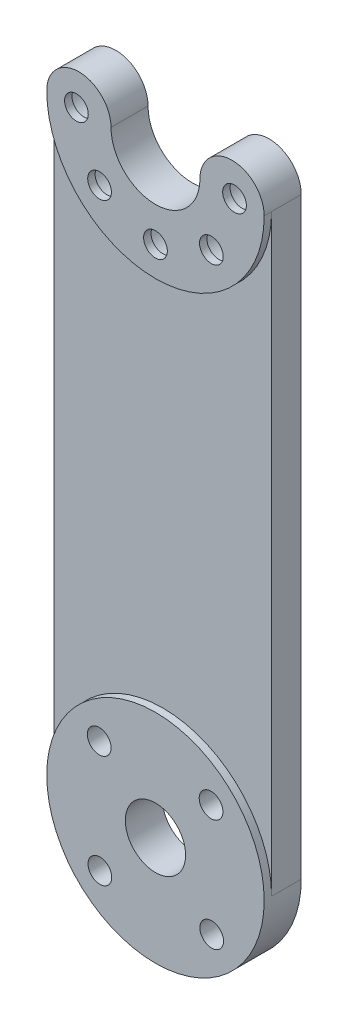
ISO-10303-21;
HEADER;
FILE_DESCRIPTION(('STEP AP214'),'2;1');
FILE_NAME('part.step','',(''),(''),'','','');
FILE_SCHEMA(('AUTOMOTIVE_DESIGN { 1 0 10303 214 1 1 1 1 }'));
ENDSEC;
DATA;
#1=APPLICATION_CONTEXT('core data for automotive mechanical design processes');
#2=APPLICATION_PROTOCOL_DEFINITION('international standard','automotive_design',2000,#1);
#3=PRODUCT_CONTEXT('',#1,'mechanical');
#4=PRODUCT('Part','Part','',(#3));
#5=PRODUCT_RELATED_PRODUCT_CATEGORY('part','',(#4));
#6=PRODUCT_DEFINITION_FORMATION('','',#4);
#7=PRODUCT_DEFINITION_CONTEXT('part definition',#1,'design');
#8=PRODUCT_DEFINITION('design','',#6,#7);
#9=PRODUCT_DEFINITION_SHAPE('','',#8);
#10=(LENGTH_UNIT() NAMED_UNIT(*) SI_UNIT(.MILLI.,.METRE.));
#11=(NAMED_UNIT(*) PLANE_ANGLE_UNIT() SI_UNIT($,.RADIAN.));
#12=(NAMED_UNIT(*) SI_UNIT($,.STERADIAN.) SOLID_ANGLE_UNIT());
#13=UNCERTAINTY_MEASURE_WITH_UNIT(LENGTH_MEASURE(1.E-05),#10,'distance_accuracy_value','');
#14=(GEOMETRIC_REPRESENTATION_CONTEXT(3) GLOBAL_UNCERTAINTY_ASSIGNED_CONTEXT((#13)) GLOBAL_UNIT_ASSIGNED_CONTEXT((#10,
#11,#12)) REPRESENTATION_CONTEXT('',''));
#15=CARTESIAN_POINT('',(0.,0.,0.));
#16=DIRECTION('',(0.,0.,1.));
#17=DIRECTION('',(1.,0.,0.));
#18=AXIS2_PLACEMENT_3D('',#15,#16,#17);
#19=CARTESIAN_POINT('',(-3.87500000000011,0.,0.));
#20=DIRECTION('',(0.,0.,1.));
#21=DIRECTION('',(1.,0.,0.));
#22=AXIS2_PLACEMENT_3D('',#19,#20,#21);
#23=PLANE('',#22);
#24=CARTESIAN_POINT('',(7.99999999999991,0.,0.));
#25=DIRECTION('',(0.,0.,1.));
#26=DIRECTION('',(1.,0.,0.));
#27=AXIS2_PLACEMENT_3D('',#24,#25,#26);
#28=CIRCLE('',#27,1.2);
#29=CARTESIAN_POINT('',(9.19999999999991,0.,0.));
#30=VERTEX_POINT('',#29);
#31=EDGE_CURVE('E383',#30,#30,#28,.T.);
#32=ORIENTED_EDGE('',*,*,#31,.F.);
#33=EDGE_LOOP('',(#32));
#34=FACE_BOUND('',#33,.T.);
#35=CARTESIAN_POINT('',(5.65685424949229,-5.65685424949237,0.));
#36=DIRECTION('',(0.,0.,1.));
#37=DIRECTION('',(1.,0.,0.));
#38=AXIS2_PLACEMENT_3D('',#35,#36,#37);
#39=CIRCLE('',#38,1.2);
#40=CARTESIAN_POINT('',(6.85685424949229,-5.65685424949237,0.));
#41=VERTEX_POINT('',#40);
#42=EDGE_CURVE('E395',#41,#41,#39,.T.);
#43=ORIENTED_EDGE('',*,*,#42,.F.);
#44=EDGE_LOOP('',(#43));
#45=FACE_BOUND('',#44,.T.);
#46=CARTESIAN_POINT('',(0.,-7.99999999999999,0.));
#47=DIRECTION('',(0.,0.,1.));
#48=DIRECTION('',(1.,0.,0.));
#49=AXIS2_PLACEMENT_3D('',#46,#47,#48);
#50=CIRCLE('',#49,1.2);
#51=CARTESIAN_POINT('',(1.19999999999991,-7.99999999999999,0.));
#52=VERTEX_POINT('',#51);
#53=EDGE_CURVE('E407',#52,#52,#50,.T.);
#54=ORIENTED_EDGE('',*,*,#53,.F.);
#55=EDGE_LOOP('',(#54));
#56=FACE_BOUND('',#55,.T.);
#57=CARTESIAN_POINT('',(-5.65685424949247,-5.65685424949237,0.));
#58=DIRECTION('',(0.,0.,1.));
#59=DIRECTION('',(1.,0.,0.));
#60=AXIS2_PLACEMENT_3D('',#57,#58,#59);
#61=CIRCLE('',#60,1.2);
#62=CARTESIAN_POINT('',(-4.45685424949247,-5.65685424949237,0.));
#63=VERTEX_POINT('',#62);
#64=EDGE_CURVE('E419',#63,#63,#61,.T.);
#65=ORIENTED_EDGE('',*,*,#64,.F.);
#66=EDGE_LOOP('',(#65));
#67=FACE_BOUND('',#66,.T.);
#68=CARTESIAN_POINT('',(-8.00000000000009,0.,0.));
#69=DIRECTION('',(0.,0.,1.));
#70=DIRECTION('',(1.,0.,0.));
#71=AXIS2_PLACEMENT_3D('',#68,#69,#70);
#72=CIRCLE('',#71,1.2);
#73=CARTESIAN_POINT('',(-6.80000000000009,0.,0.));
#74=VERTEX_POINT('',#73);
#75=EDGE_CURVE('E138',#74,#74,#72,.T.);
#76=ORIENTED_EDGE('',*,*,#75,.F.);
#77=EDGE_LOOP('',(#76));
#78=FACE_BOUND('',#77,.T.);
#79=CARTESIAN_POINT('',(-7.75000000000013,0.,0.));
#80=DIRECTION('',(0.,0.,1.));
#81=DIRECTION('',(1.,0.,0.));
#82=AXIS2_PLACEMENT_3D('',#79,#80,#81);
#83=CIRCLE('',#82,3.24999999999996);
#84=CARTESIAN_POINT('',(-4.50000000000017,0.,0.));
#85=VERTEX_POINT('',#84);
#86=CARTESIAN_POINT('',(-11.0000000000002,0.,0.));
#87=VERTEX_POINT('',#86);
#88=EDGE_CURVE('E144',#85,#87,#83,.T.);
#89=ORIENTED_EDGE('',*,*,#88,.T.);
#90=CARTESIAN_POINT('',(0.,0.,0.));
#91=DIRECTION('',(0.,0.,1.));
#92=DIRECTION('',(-1.,0.,0.));
#93=AXIS2_PLACEMENT_3D('',#90,#91,#92);
#94=CIRCLE('',#93,11.0000000000001);
#95=CARTESIAN_POINT('',(11.0000000000002,0.,0.));
#96=VERTEX_POINT('',#95);
#97=EDGE_CURVE('E151',#87,#96,#94,.T.);
#98=ORIENTED_EDGE('',*,*,#97,.T.);
#99=CARTESIAN_POINT('',(7.75000000000013,0.,0.));
#100=DIRECTION('',(0.,0.,1.));
#101=DIRECTION('',(1.,0.,0.));
#102=AXIS2_PLACEMENT_3D('',#99,#100,#101);
#103=CIRCLE('',#102,3.25000000000004);
#104=CARTESIAN_POINT('',(4.5,0.,0.));
#105=VERTEX_POINT('',#104);
#106=EDGE_CURVE('E148',#96,#105,#103,.T.);
#107=ORIENTED_EDGE('',*,*,#106,.T.);
#108=CARTESIAN_POINT('',(0.,0.,0.));
#109=DIRECTION('',(0.,0.,-1.));
#110=DIRECTION('',(1.,0.,0.));
#111=AXIS2_PLACEMENT_3D('',#108,#109,#110);
#112=CIRCLE('',#111,4.50000000000009);
#113=EDGE_CURVE('E145',#105,#85,#112,.T.);
#114=ORIENTED_EDGE('',*,*,#113,.T.);
#115=EDGE_LOOP('',(#89,#98,#107,#114));
#116=FACE_BOUND('',#115,.T.);
#117=ADVANCED_FACE('F35',(#34,#45,#56,#67,#78,#116),#23,.T.);
#118=CARTESIAN_POINT('',(0.,0.,-28.9618770789125));
#119=DIRECTION('',(0.,0.,1.));
#120=DIRECTION('',(1.,0.,0.));
#121=AXIS2_PLACEMENT_3D('',#118,#119,#120);
#122=CYLINDRICAL_SURFACE('',#121,11.0000000000001);
#123=DIRECTION('',(0.,0.,1.));
#124=VECTOR('',#123,1.);
#125=CARTESIAN_POINT('',(-11.0000000000002,0.,-28.9618770789125));
#126=LINE('',#125,#124);
#127=CARTESIAN_POINT('',(-11.0000000000002,0.,-0.749999999999987));
#128=VERTEX_POINT('',#127);
#129=EDGE_CURVE('E11',#128,#87,#126,.T.);
#130=ORIENTED_EDGE('',*,*,#129,.F.);
#131=CARTESIAN_POINT('',(0.,0.,-0.749999999999987));
#132=DIRECTION('',(0.,0.,-1.));
#133=DIRECTION('',(-1.,0.,0.));
#134=AXIS2_PLACEMENT_3D('',#131,#132,#133);
#135=CIRCLE('',#134,11.0000000000001);
#136=CARTESIAN_POINT('',(11.0000000000002,0.,-0.749999999999983));
#137=VERTEX_POINT('',#136);
#138=EDGE_CURVE('E95',#128,#137,#135,.F.);
#139=ORIENTED_EDGE('',*,*,#138,.T.);
#140=DIRECTION('',(0.,0.,1.));
#141=VECTOR('',#140,1.);
#142=CARTESIAN_POINT('',(11.0000000000002,0.,-28.9618770789125));
#143=LINE('',#142,#141);
#144=EDGE_CURVE('E67',#137,#96,#143,.T.);
#145=ORIENTED_EDGE('',*,*,#144,.T.);
#146=ORIENTED_EDGE('',*,*,#97,.F.);
#147=EDGE_LOOP('',(#130,#139,#145,#146));
#148=FACE_BOUND('',#147,.T.);
#149=ADVANCED_FACE('F37',(#148),#122,.T.);
#150=CARTESIAN_POINT('',(7.75000000000013,0.,-28.9618770789125));
#151=DIRECTION('',(0.,0.,1.));
#152=DIRECTION('',(1.,0.,0.));
#153=AXIS2_PLACEMENT_3D('',#150,#151,#152);
#154=CYLINDRICAL_SURFACE('',#153,3.25000000000004);
#155=ORIENTED_EDGE('',*,*,#144,.F.);
#156=DIRECTION('',(0.,0.,1.));
#157=VECTOR('',#156,1.);
#158=CARTESIAN_POINT('',(11.0000000000002,0.,-3.74999999999999));
#159=LINE('',#158,#157);
#160=CARTESIAN_POINT('',(11.0000000000002,0.,-3.74999999999999));
#161=VERTEX_POINT('',#160);
#162=EDGE_CURVE('E125',#161,#137,#159,.T.);
#163=ORIENTED_EDGE('',*,*,#162,.F.);
#164=CARTESIAN_POINT('',(7.75000000000013,0.,-3.74999999999999));
#165=DIRECTION('',(0.,0.,-1.));
#166=DIRECTION('',(-1.,0.,0.));
#167=AXIS2_PLACEMENT_3D('',#164,#165,#166);
#168=CIRCLE('',#167,3.25000000000004);
#169=CARTESIAN_POINT('',(4.50000000000009,0.,-3.74999999999999));
#170=VERTEX_POINT('',#169);
#171=EDGE_CURVE('E116',#170,#161,#168,.T.);
#172=ORIENTED_EDGE('',*,*,#171,.F.);
#173=DIRECTION('',(0.,0.,1.));
#174=VECTOR('',#173,1.);
#175=CARTESIAN_POINT('',(4.5,0.,-28.9618770789125));
#176=LINE('',#175,#174);
#177=EDGE_CURVE('E158',#170,#105,#176,.T.);
#178=ORIENTED_EDGE('',*,*,#177,.T.);
#179=ORIENTED_EDGE('',*,*,#106,.F.);
#180=EDGE_LOOP('',(#155,#163,#172,#178,#179));
#181=FACE_BOUND('',#180,.T.);
#182=ADVANCED_FACE('F160',(#181),#154,.T.);
#183=CARTESIAN_POINT('',(0.,0.,-28.9618770789125));
#184=DIRECTION('',(0.,0.,1.));
#185=DIRECTION('',(1.,0.,0.));
#186=AXIS2_PLACEMENT_3D('',#183,#184,#185);
#187=CYLINDRICAL_SURFACE('',#186,4.50000000000009);
#188=ORIENTED_EDGE('',*,*,#177,.F.);
#189=CARTESIAN_POINT('',(0.,0.,-3.74999999999999));
#190=DIRECTION('',(0.,0.,1.));
#191=DIRECTION('',(-1.,0.,0.));
#192=AXIS2_PLACEMENT_3D('',#189,#190,#191);
#193=CIRCLE('',#192,4.50000000000013);
#194=CARTESIAN_POINT('',(-4.50000000000022,0.,-3.74999999999999));
#195=VERTEX_POINT('',#194);
#196=EDGE_CURVE('E434',#195,#170,#193,.T.);
#197=ORIENTED_EDGE('',*,*,#196,.F.);
#198=DIRECTION('',(0.,0.,1.));
#199=VECTOR('',#198,1.);
#200=CARTESIAN_POINT('',(-4.50000000000017,0.,-28.9618770789125));
#201=LINE('',#200,#199);
#202=EDGE_CURVE('E43',#195,#85,#201,.T.);
#203=ORIENTED_EDGE('',*,*,#202,.T.);
#204=ORIENTED_EDGE('',*,*,#113,.F.);
#205=EDGE_LOOP('',(#188,#197,#203,#204));
#206=FACE_BOUND('',#205,.T.);
#207=ADVANCED_FACE('F162',(#206),#187,.F.);
#208=CARTESIAN_POINT('',(-7.75000000000013,0.,-28.9618770789125));
#209=DIRECTION('',(0.,0.,1.));
#210=DIRECTION('',(1.,0.,0.));
#211=AXIS2_PLACEMENT_3D('',#208,#209,#210);
#212=CYLINDRICAL_SURFACE('',#211,3.24999999999996);
#213=ORIENTED_EDGE('',*,*,#202,.F.);
#214=CARTESIAN_POINT('',(-7.75000000000013,0.,-3.74999999999999));
#215=DIRECTION('',(0.,0.,-1.));
#216=DIRECTION('',(-1.,0.,0.));
#217=AXIS2_PLACEMENT_3D('',#214,#215,#216);
#218=CIRCLE('',#217,3.25);
#219=CARTESIAN_POINT('',(-11.0000000000002,0.,-3.74999999999999));
#220=VERTEX_POINT('',#219);
#221=EDGE_CURVE('E140',#220,#195,#218,.T.);
#222=ORIENTED_EDGE('',*,*,#221,.F.);
#223=DIRECTION('',(0.,0.,1.));
#224=VECTOR('',#223,1.);
#225=CARTESIAN_POINT('',(-11.0000000000002,0.,-3.74999999999999));
#226=LINE('',#225,#224);
#227=EDGE_CURVE('E132',#220,#128,#226,.T.);
#228=ORIENTED_EDGE('',*,*,#227,.T.);
#229=ORIENTED_EDGE('',*,*,#129,.T.);
#230=ORIENTED_EDGE('',*,*,#88,.F.);
#231=EDGE_LOOP('',(#213,#222,#228,#229,#230));
#232=FACE_BOUND('',#231,.T.);
#233=ADVANCED_FACE('F164',(#232),#212,.T.);
#234=CARTESIAN_POINT('',(11.0000000000002,0.,-3.74999999999999));
#235=DIRECTION('',(-1.,0.,0.));
#236=DIRECTION('',(0.,0.,1.));
#237=AXIS2_PLACEMENT_3D('',#234,#235,#236);
#238=PLANE('',#237);
#239=DIRECTION('',(0.,-1.,0.));
#240=VECTOR('',#239,1.);
#241=CARTESIAN_POINT('',(11.0000000000002,0.,-0.749999999999987));
#242=LINE('',#241,#240);
#243=CARTESIAN_POINT('',(11.0000000000002,-60.,-0.749999999999987));
#244=VERTEX_POINT('',#243);
#245=EDGE_CURVE('E75',#137,#244,#242,.T.);
#246=ORIENTED_EDGE('',*,*,#245,.T.);
#247=DIRECTION('',(0.,0.,1.));
#248=VECTOR('',#247,1.);
#249=CARTESIAN_POINT('',(11.0000000000002,-60.,-3.74999999999999));
#250=LINE('',#249,#248);
#251=CARTESIAN_POINT('',(11.0000000000002,-60.,-3.74999999999999));
#252=VERTEX_POINT('',#251);
#253=EDGE_CURVE('E121',#252,#244,#250,.T.);
#254=ORIENTED_EDGE('',*,*,#253,.F.);
#255=DIRECTION('',(0.,-1.,0.));
#256=VECTOR('',#255,1.);
#257=CARTESIAN_POINT('',(11.0000000000002,0.,-3.74999999999999));
#258=LINE('',#257,#256);
#259=EDGE_CURVE('E108',#161,#252,#258,.T.);
#260=ORIENTED_EDGE('',*,*,#259,.F.);
#261=ORIENTED_EDGE('',*,*,#162,.T.);
#262=EDGE_LOOP('',(#246,#254,#260,#261));
#263=FACE_BOUND('',#262,.T.);
#264=ADVANCED_FACE('F122',(#263),#238,.F.);
#265=CARTESIAN_POINT('',(0.,-59.9999999999999,-3.74999999999999));
#266=DIRECTION('',(0.,0.,1.));
#267=DIRECTION('',(1.,0.,0.));
#268=AXIS2_PLACEMENT_3D('',#265,#266,#267);
#269=CYLINDRICAL_SURFACE('',#268,11.0000000000002);
#270=ORIENTED_EDGE('',*,*,#253,.T.);
#271=CARTESIAN_POINT('',(0.,-59.9999999999999,-0.749999999999987));
#272=DIRECTION('',(0.,0.,1.));
#273=DIRECTION('',(1.,0.,0.));
#274=AXIS2_PLACEMENT_3D('',#271,#272,#273);
#275=CIRCLE('',#274,11.0000000000002);
#276=CARTESIAN_POINT('',(-11.0000000000002,-59.9999999999999,-0.749999999999987));
#277=VERTEX_POINT('',#276);
#278=EDGE_CURVE('E367',#244,#277,#275,.T.);
#279=ORIENTED_EDGE('',*,*,#278,.T.);
#280=DIRECTION('',(0.,0.,1.));
#281=VECTOR('',#280,1.);
#282=CARTESIAN_POINT('',(-11.0000000000002,-60.,-3.74999999999999));
#283=LINE('',#282,#281);
#284=CARTESIAN_POINT('',(-11.0000000000002,-60.,-3.74999999999999));
#285=VERTEX_POINT('',#284);
#286=EDGE_CURVE('E126',#285,#277,#283,.T.);
#287=ORIENTED_EDGE('',*,*,#286,.F.);
#288=CARTESIAN_POINT('',(0.,-59.9999999999999,-3.74999999999999));
#289=DIRECTION('',(0.,0.,-1.));
#290=DIRECTION('',(-1.,0.,0.));
#291=AXIS2_PLACEMENT_3D('',#288,#289,#290);
#292=CIRCLE('',#291,11.0000000000002);
#293=EDGE_CURVE('E112',#252,#285,#292,.T.);
#294=ORIENTED_EDGE('',*,*,#293,.F.);
#295=EDGE_LOOP('',(#270,#279,#287,#294));
#296=FACE_BOUND('',#295,.T.);
#297=CARTESIAN_POINT('',(0.,-59.9999999999999,0.));
#298=DIRECTION('',(0.,0.,-1.));
#299=DIRECTION('',(0.,1.,0.));
#300=AXIS2_PLACEMENT_3D('',#297,#298,#299);
#301=CIRCLE('',#300,11.0000000000002);
#302=CARTESIAN_POINT('',(0.,-48.9999999999997,0.));
#303=VERTEX_POINT('',#302);
#304=EDGE_CURVE('E371',#303,#303,#301,.T.);
#305=ORIENTED_EDGE('',*,*,#304,.T.);
#306=EDGE_LOOP('',(#305));
#307=FACE_BOUND('',#306,.T.);
#308=ADVANCED_FACE('F128',(#296,#307),#269,.T.);
#309=CARTESIAN_POINT('',(-11.0000000000002,-60.,-3.74999999999999));
#310=DIRECTION('',(1.,0.,0.));
#311=DIRECTION('',(0.,0.,-1.));
#312=AXIS2_PLACEMENT_3D('',#309,#310,#311);
#313=PLANE('',#312);
#314=DIRECTION('',(0.,1.,0.));
#315=VECTOR('',#314,1.);
#316=CARTESIAN_POINT('',(-11.0000000000002,-60.,-0.749999999999987));
#317=LINE('',#316,#315);
#318=EDGE_CURVE('E137',#277,#128,#317,.T.);
#319=ORIENTED_EDGE('',*,*,#318,.T.);
#320=ORIENTED_EDGE('',*,*,#227,.F.);
#321=DIRECTION('',(0.,1.,0.));
#322=VECTOR('',#321,1.);
#323=CARTESIAN_POINT('',(-11.0000000000002,-60.,-3.74999999999999));
#324=LINE('',#323,#322);
#325=EDGE_CURVE('E84',#285,#220,#324,.T.);
#326=ORIENTED_EDGE('',*,*,#325,.F.);
#327=ORIENTED_EDGE('',*,*,#286,.T.);
#328=EDGE_LOOP('',(#319,#320,#326,#327));
#329=FACE_BOUND('',#328,.T.);
#330=ADVANCED_FACE('F184',(#329),#313,.F.);
#331=CARTESIAN_POINT('',(-7.75000000000013,0.,-3.74999999999999));
#332=DIRECTION('',(0.,0.,-1.));
#333=DIRECTION('',(-1.,0.,0.));
#334=AXIS2_PLACEMENT_3D('',#331,#332,#333);
#335=PLANE('',#334);
#336=CARTESIAN_POINT('',(5.6887856422345,-65.6247415866602,-3.74999999999999));
#337=DIRECTION('',(0.,0.,-1.));
#338=DIRECTION('',(-1.,0.,0.));
#339=AXIS2_PLACEMENT_3D('',#336,#337,#338);
#340=CIRCLE('',#339,2.19999999999999);
#341=CARTESIAN_POINT('',(3.4887856422345,-65.6247415866602,-3.74999999999999));
#342=VERTEX_POINT('',#341);
#343=EDGE_CURVE('E317',#342,#342,#340,.T.);
#344=ORIENTED_EDGE('',*,*,#343,.F.);
#345=EDGE_LOOP('',(#344));
#346=FACE_BOUND('',#345,.T.);
#347=CARTESIAN_POINT('',(5.62474158666032,-54.3112143577653,-3.74999999999999));
#348=DIRECTION('',(0.,0.,-1.));
#349=DIRECTION('',(-1.,0.,0.));
#350=AXIS2_PLACEMENT_3D('',#347,#348,#349);
#351=CIRCLE('',#350,2.19999999999999);
#352=CARTESIAN_POINT('',(3.42474158666033,-54.3112143577653,-3.74999999999999));
#353=VERTEX_POINT('',#352);
#354=EDGE_CURVE('E327',#353,#353,#351,.T.);
#355=ORIENTED_EDGE('',*,*,#354,.F.);
#356=EDGE_LOOP('',(#355));
#357=FACE_BOUND('',#356,.T.);
#358=CARTESIAN_POINT('',(-5.68878564223454,-54.3752584133395,-3.74999999999999));
#359=DIRECTION('',(0.,0.,-1.));
#360=DIRECTION('',(-1.,0.,0.));
#361=AXIS2_PLACEMENT_3D('',#358,#359,#360);
#362=CIRCLE('',#361,2.19999999999999);
#363=CARTESIAN_POINT('',(-7.88878564223453,-54.3752584133395,-3.74999999999999));
#364=VERTEX_POINT('',#363);
#365=EDGE_CURVE('E339',#364,#364,#362,.T.);
#366=ORIENTED_EDGE('',*,*,#365,.F.);
#367=EDGE_LOOP('',(#366));
#368=FACE_BOUND('',#367,.T.);
#369=CARTESIAN_POINT('',(-5.62474158666032,-65.6887856422344,-3.74999999999999));
#370=DIRECTION('',(0.,0.,-1.));
#371=DIRECTION('',(-1.,0.,0.));
#372=AXIS2_PLACEMENT_3D('',#369,#370,#371);
#373=CIRCLE('',#372,2.19999999999999);
#374=CARTESIAN_POINT('',(-7.82474158666031,-65.6887856422344,-3.74999999999999));
#375=VERTEX_POINT('',#374);
#376=EDGE_CURVE('E351',#375,#375,#373,.T.);
#377=ORIENTED_EDGE('',*,*,#376,.F.);
#378=EDGE_LOOP('',(#377));
#379=FACE_BOUND('',#378,.T.);
#380=CARTESIAN_POINT('',(0.,-59.9999999999999,-3.74999999999999));
#381=DIRECTION('',(0.,0.,-1.));
#382=DIRECTION('',(-1.,0.,0.));
#383=AXIS2_PLACEMENT_3D('',#380,#381,#382);
#384=CIRCLE('',#383,3.05000000000001);
#385=CARTESIAN_POINT('',(-3.05000000000001,-59.9999999999999,-3.74999999999999));
#386=VERTEX_POINT('',#385);
#387=EDGE_CURVE('E363',#386,#386,#384,.T.);
#388=ORIENTED_EDGE('',*,*,#387,.F.);
#389=EDGE_LOOP('',(#388));
#390=FACE_BOUND('',#389,.T.);
#391=CARTESIAN_POINT('',(7.99999999999991,0.,-3.74999999999999));
#392=DIRECTION('',(0.,0.,-1.));
#393=DIRECTION('',(-1.,0.,0.));
#394=AXIS2_PLACEMENT_3D('',#391,#392,#393);
#395=CIRCLE('',#394,2.2);
#396=CARTESIAN_POINT('',(5.79999999999991,0.,-3.74999999999999));
#397=VERTEX_POINT('',#396);
#398=EDGE_CURVE('E374',#397,#397,#395,.T.);
#399=ORIENTED_EDGE('',*,*,#398,.F.);
#400=EDGE_LOOP('',(#399));
#401=FACE_BOUND('',#400,.T.);
#402=CARTESIAN_POINT('',(5.65685424949229,-5.65685424949237,-3.74999999999999));
#403=DIRECTION('',(0.,0.,-1.));
#404=DIRECTION('',(-1.,0.,0.));
#405=AXIS2_PLACEMENT_3D('',#402,#403,#404);
#406=CIRCLE('',#405,2.2);
#407=CARTESIAN_POINT('',(3.45685424949229,-5.65685424949237,-3.74999999999999));
#408=VERTEX_POINT('',#407);
#409=EDGE_CURVE('E386',#408,#408,#406,.T.);
#410=ORIENTED_EDGE('',*,*,#409,.F.);
#411=EDGE_LOOP('',(#410));
#412=FACE_BOUND('',#411,.T.);
#413=CARTESIAN_POINT('',(0.,-7.99999999999999,-3.74999999999999));
#414=DIRECTION('',(0.,0.,-1.));
#415=DIRECTION('',(-1.,0.,0.));
#416=AXIS2_PLACEMENT_3D('',#413,#414,#415);
#417=CIRCLE('',#416,2.2);
#418=CARTESIAN_POINT('',(-2.20000000000009,-7.99999999999999,-3.74999999999999));
#419=VERTEX_POINT('',#418);
#420=EDGE_CURVE('E398',#419,#419,#417,.T.);
#421=ORIENTED_EDGE('',*,*,#420,.F.);
#422=EDGE_LOOP('',(#421));
#423=FACE_BOUND('',#422,.T.);
#424=CARTESIAN_POINT('',(-5.65685424949247,-5.65685424949237,-3.74999999999999));
#425=DIRECTION('',(0.,0.,-1.));
#426=DIRECTION('',(-1.,0.,0.));
#427=AXIS2_PLACEMENT_3D('',#424,#425,#426);
#428=CIRCLE('',#427,2.2);
#429=CARTESIAN_POINT('',(-7.85685424949247,-5.65685424949237,-3.74999999999999));
#430=VERTEX_POINT('',#429);
#431=EDGE_CURVE('E410',#430,#430,#428,.T.);
#432=ORIENTED_EDGE('',*,*,#431,.F.);
#433=EDGE_LOOP('',(#432));
#434=FACE_BOUND('',#433,.T.);
#435=CARTESIAN_POINT('',(-8.00000000000009,0.,-3.74999999999999));
#436=DIRECTION('',(0.,0.,-1.));
#437=DIRECTION('',(-1.,0.,0.));
#438=AXIS2_PLACEMENT_3D('',#435,#436,#437);
#439=CIRCLE('',#438,2.2);
#440=CARTESIAN_POINT('',(-10.2000000000001,0.,-3.74999999999999));
#441=VERTEX_POINT('',#440);
#442=EDGE_CURVE('E422',#441,#441,#439,.T.);
#443=ORIENTED_EDGE('',*,*,#442,.F.);
#444=EDGE_LOOP('',(#443));
#445=FACE_BOUND('',#444,.T.);
#446=ORIENTED_EDGE('',*,*,#221,.T.);
#447=ORIENTED_EDGE('',*,*,#196,.T.);
#448=ORIENTED_EDGE('',*,*,#171,.T.);
#449=ORIENTED_EDGE('',*,*,#259,.T.);
#450=ORIENTED_EDGE('',*,*,#293,.T.);
#451=ORIENTED_EDGE('',*,*,#325,.T.);
#452=EDGE_LOOP('',(#446,#447,#448,#449,#450,#451));
#453=FACE_BOUND('',#452,.T.);
#454=ADVANCED_FACE('F110',(#346,#357,#368,#379,#390,#401,#412,#423,#434,#445,#453),#335,.T.);
#455=CARTESIAN_POINT('',(-7.75000000000013,0.,-0.749999999999987));
#456=DIRECTION('',(0.,0.,-1.));
#457=DIRECTION('',(-1.,0.,0.));
#458=AXIS2_PLACEMENT_3D('',#455,#456,#457);
#459=PLANE('',#458);
#460=ORIENTED_EDGE('',*,*,#278,.F.);
#461=ORIENTED_EDGE('',*,*,#245,.F.);
#462=ORIENTED_EDGE('',*,*,#138,.F.);
#463=ORIENTED_EDGE('',*,*,#318,.F.);
#464=EDGE_LOOP('',(#460,#461,#462,#463));
#465=FACE_BOUND('',#464,.T.);
#466=ADVANCED_FACE('F188',(#465),#459,.F.);
#467=CARTESIAN_POINT('',(-8.00000000000009,0.,-3.74999999999999));
#468=DIRECTION('',(0.,0.,-1.));
#469=DIRECTION('',(-1.,0.,0.));
#470=AXIS2_PLACEMENT_3D('',#467,#468,#469);
#471=CYLINDRICAL_SURFACE('',#470,1.2);
#472=CARTESIAN_POINT('',(-8.00000000000009,0.,-0.749999999999987));
#473=DIRECTION('',(0.,0.,-1.));
#474=DIRECTION('',(-1.,0.,0.));
#475=AXIS2_PLACEMENT_3D('',#472,#473,#474);
#476=CIRCLE('',#475,1.2);
#477=CARTESIAN_POINT('',(-9.20000000000009,0.,-0.749999999999987));
#478=VERTEX_POINT('',#477);
#479=EDGE_CURVE('E428',#478,#478,#476,.T.);
#480=ORIENTED_EDGE('',*,*,#479,.T.);
#481=EDGE_LOOP('',(#480));
#482=FACE_BOUND('',#481,.T.);
#483=ORIENTED_EDGE('',*,*,#75,.T.);
#484=EDGE_LOOP('',(#483));
#485=FACE_BOUND('',#484,.T.);
#486=ADVANCED_FACE('F191',(#482,#485),#471,.F.);
#487=CARTESIAN_POINT('',(-6.80000000000009,0.,-0.749999999999987));
#488=DIRECTION('',(0.,0.,1.));
#489=DIRECTION('',(1.,0.,0.));
#490=AXIS2_PLACEMENT_3D('',#487,#488,#489);
#491=PLANE('',#490);
#492=ORIENTED_EDGE('',*,*,#479,.F.);
#493=EDGE_LOOP('',(#492));
#494=FACE_BOUND('',#493,.T.);
#495=CARTESIAN_POINT('',(-8.00000000000009,0.,-0.749999999999987));
#496=DIRECTION('',(0.,0.,-1.));
#497=DIRECTION('',(-1.,0.,0.));
#498=AXIS2_PLACEMENT_3D('',#495,#496,#497);
#499=CIRCLE('',#498,2.2);
#500=CARTESIAN_POINT('',(-10.2000000000001,0.,-0.749999999999987));
#501=VERTEX_POINT('',#500);
#502=EDGE_CURVE('E425',#501,#501,#499,.T.);
#503=ORIENTED_EDGE('',*,*,#502,.T.);
#504=EDGE_LOOP('',(#503));
#505=FACE_BOUND('',#504,.T.);
#506=ADVANCED_FACE('F197',(#494,#505),#491,.F.);
#507=CARTESIAN_POINT('',(-8.00000000000009,0.,-3.74999999999999));
#508=DIRECTION('',(0.,0.,-1.));
#509=DIRECTION('',(-1.,0.,0.));
#510=AXIS2_PLACEMENT_3D('',#507,#508,#509);
#511=CYLINDRICAL_SURFACE('',#510,2.2);
#512=ORIENTED_EDGE('',*,*,#502,.F.);
#513=EDGE_LOOP('',(#512));
#514=FACE_BOUND('',#513,.T.);
#515=ORIENTED_EDGE('',*,*,#442,.T.);
#516=EDGE_LOOP('',(#515));
#517=FACE_BOUND('',#516,.T.);
#518=ADVANCED_FACE('F201',(#514,#517),#511,.F.);
#519=CARTESIAN_POINT('',(-5.65685424949247,-5.65685424949237,-3.74999999999999));
#520=DIRECTION('',(0.,0.,-1.));
#521=DIRECTION('',(-1.,0.,0.));
#522=AXIS2_PLACEMENT_3D('',#519,#520,#521);
#523=CYLINDRICAL_SURFACE('',#522,1.2);
#524=CARTESIAN_POINT('',(-5.65685424949247,-5.65685424949237,-0.749999999999987));
#525=DIRECTION('',(0.,0.,-1.));
#526=DIRECTION('',(-1.,0.,0.));
#527=AXIS2_PLACEMENT_3D('',#524,#525,#526);
#528=CIRCLE('',#527,1.2);
#529=CARTESIAN_POINT('',(-6.85685424949247,-5.65685424949237,-0.749999999999987));
#530=VERTEX_POINT('',#529);
#531=EDGE_CURVE('E416',#530,#530,#528,.T.);
#532=ORIENTED_EDGE('',*,*,#531,.T.);
#533=EDGE_LOOP('',(#532));
#534=FACE_BOUND('',#533,.T.);
#535=ORIENTED_EDGE('',*,*,#64,.T.);
#536=EDGE_LOOP('',(#535));
#537=FACE_BOUND('',#536,.T.);
#538=ADVANCED_FACE('F205',(#534,#537),#523,.F.);
#539=CARTESIAN_POINT('',(-4.45685424949247,-5.65685424949237,-0.749999999999987));
#540=DIRECTION('',(0.,0.,1.));
#541=DIRECTION('',(1.,0.,0.));
#542=AXIS2_PLACEMENT_3D('',#539,#540,#541);
#543=PLANE('',#542);
#544=ORIENTED_EDGE('',*,*,#531,.F.);
#545=EDGE_LOOP('',(#544));
#546=FACE_BOUND('',#545,.T.);
#547=CARTESIAN_POINT('',(-5.65685424949247,-5.65685424949237,-0.749999999999987));
#548=DIRECTION('',(0.,0.,-1.));
#549=DIRECTION('',(-1.,0.,0.));
#550=AXIS2_PLACEMENT_3D('',#547,#548,#549);
#551=CIRCLE('',#550,2.2);
#552=CARTESIAN_POINT('',(-7.85685424949247,-5.65685424949237,-0.749999999999987));
#553=VERTEX_POINT('',#552);
#554=EDGE_CURVE('E413',#553,#553,#551,.T.);
#555=ORIENTED_EDGE('',*,*,#554,.T.);
#556=EDGE_LOOP('',(#555));
#557=FACE_BOUND('',#556,.T.);
#558=ADVANCED_FACE('F209',(#546,#557),#543,.F.);
#559=CARTESIAN_POINT('',(-5.65685424949247,-5.65685424949237,-3.74999999999999));
#560=DIRECTION('',(0.,0.,-1.));
#561=DIRECTION('',(-1.,0.,0.));
#562=AXIS2_PLACEMENT_3D('',#559,#560,#561);
#563=CYLINDRICAL_SURFACE('',#562,2.2);
#564=ORIENTED_EDGE('',*,*,#554,.F.);
#565=EDGE_LOOP('',(#564));
#566=FACE_BOUND('',#565,.T.);
#567=ORIENTED_EDGE('',*,*,#431,.T.);
#568=EDGE_LOOP('',(#567));
#569=FACE_BOUND('',#568,.T.);
#570=ADVANCED_FACE('F213',(#566,#569),#563,.F.);
#571=CARTESIAN_POINT('',(0.,-7.99999999999999,-3.74999999999999));
#572=DIRECTION('',(0.,0.,-1.));
#573=DIRECTION('',(-1.,0.,0.));
#574=AXIS2_PLACEMENT_3D('',#571,#572,#573);
#575=CYLINDRICAL_SURFACE('',#574,1.2);
#576=CARTESIAN_POINT('',(0.,-7.99999999999999,-0.749999999999987));
#577=DIRECTION('',(0.,0.,-1.));
#578=DIRECTION('',(-1.,0.,0.));
#579=AXIS2_PLACEMENT_3D('',#576,#577,#578);
#580=CIRCLE('',#579,1.2);
#581=CARTESIAN_POINT('',(-1.20000000000009,-7.99999999999999,-0.749999999999987));
#582=VERTEX_POINT('',#581);
#583=EDGE_CURVE('E404',#582,#582,#580,.T.);
#584=ORIENTED_EDGE('',*,*,#583,.T.);
#585=EDGE_LOOP('',(#584));
#586=FACE_BOUND('',#585,.T.);
#587=ORIENTED_EDGE('',*,*,#53,.T.);
#588=EDGE_LOOP('',(#587));
#589=FACE_BOUND('',#588,.T.);
#590=ADVANCED_FACE('F217',(#586,#589),#575,.F.);
#591=CARTESIAN_POINT('',(1.19999999999991,-7.99999999999999,-0.749999999999987));
#592=DIRECTION('',(0.,0.,1.));
#593=DIRECTION('',(1.,0.,0.));
#594=AXIS2_PLACEMENT_3D('',#591,#592,#593);
#595=PLANE('',#594);
#596=ORIENTED_EDGE('',*,*,#583,.F.);
#597=EDGE_LOOP('',(#596));
#598=FACE_BOUND('',#597,.T.);
#599=CARTESIAN_POINT('',(0.,-7.99999999999999,-0.749999999999987));
#600=DIRECTION('',(0.,0.,-1.));
#601=DIRECTION('',(-1.,0.,0.));
#602=AXIS2_PLACEMENT_3D('',#599,#600,#601);
#603=CIRCLE('',#602,2.2);
#604=CARTESIAN_POINT('',(-2.20000000000009,-7.99999999999999,-0.749999999999987));
#605=VERTEX_POINT('',#604);
#606=EDGE_CURVE('E401',#605,#605,#603,.T.);
#607=ORIENTED_EDGE('',*,*,#606,.T.);
#608=EDGE_LOOP('',(#607));
#609=FACE_BOUND('',#608,.T.);
#610=ADVANCED_FACE('F221',(#598,#609),#595,.F.);
#611=CARTESIAN_POINT('',(0.,-7.99999999999999,-3.74999999999999));
#612=DIRECTION('',(0.,0.,-1.));
#613=DIRECTION('',(-1.,0.,0.));
#614=AXIS2_PLACEMENT_3D('',#611,#612,#613);
#615=CYLINDRICAL_SURFACE('',#614,2.2);
#616=ORIENTED_EDGE('',*,*,#606,.F.);
#617=EDGE_LOOP('',(#616));
#618=FACE_BOUND('',#617,.T.);
#619=ORIENTED_EDGE('',*,*,#420,.T.);
#620=EDGE_LOOP('',(#619));
#621=FACE_BOUND('',#620,.T.);
#622=ADVANCED_FACE('F225',(#618,#621),#615,.F.);
#623=CARTESIAN_POINT('',(5.65685424949229,-5.65685424949237,-3.74999999999999));
#624=DIRECTION('',(0.,0.,-1.));
#625=DIRECTION('',(-1.,0.,0.));
#626=AXIS2_PLACEMENT_3D('',#623,#624,#625);
#627=CYLINDRICAL_SURFACE('',#626,1.2);
#628=CARTESIAN_POINT('',(5.65685424949229,-5.65685424949237,-0.749999999999987));
#629=DIRECTION('',(0.,0.,-1.));
#630=DIRECTION('',(-1.,0.,0.));
#631=AXIS2_PLACEMENT_3D('',#628,#629,#630);
#632=CIRCLE('',#631,1.2);
#633=CARTESIAN_POINT('',(4.45685424949229,-5.65685424949237,-0.749999999999987));
#634=VERTEX_POINT('',#633);
#635=EDGE_CURVE('E392',#634,#634,#632,.T.);
#636=ORIENTED_EDGE('',*,*,#635,.T.);
#637=EDGE_LOOP('',(#636));
#638=FACE_BOUND('',#637,.T.);
#639=ORIENTED_EDGE('',*,*,#42,.T.);
#640=EDGE_LOOP('',(#639));
#641=FACE_BOUND('',#640,.T.);
#642=ADVANCED_FACE('F229',(#638,#641),#627,.F.);
#643=CARTESIAN_POINT('',(6.85685424949229,-5.65685424949237,-0.749999999999987));
#644=DIRECTION('',(0.,0.,1.));
#645=DIRECTION('',(1.,0.,0.));
#646=AXIS2_PLACEMENT_3D('',#643,#644,#645);
#647=PLANE('',#646);
#648=ORIENTED_EDGE('',*,*,#635,.F.);
#649=EDGE_LOOP('',(#648));
#650=FACE_BOUND('',#649,.T.);
#651=CARTESIAN_POINT('',(5.65685424949229,-5.65685424949237,-0.749999999999987));
#652=DIRECTION('',(0.,0.,-1.));
#653=DIRECTION('',(-1.,0.,0.));
#654=AXIS2_PLACEMENT_3D('',#651,#652,#653);
#655=CIRCLE('',#654,2.2);
#656=CARTESIAN_POINT('',(3.45685424949229,-5.65685424949237,-0.749999999999987));
#657=VERTEX_POINT('',#656);
#658=EDGE_CURVE('E389',#657,#657,#655,.T.);
#659=ORIENTED_EDGE('',*,*,#658,.T.);
#660=EDGE_LOOP('',(#659));
#661=FACE_BOUND('',#660,.T.);
#662=ADVANCED_FACE('F233',(#650,#661),#647,.F.);
#663=CARTESIAN_POINT('',(5.65685424949229,-5.65685424949237,-3.74999999999999));
#664=DIRECTION('',(0.,0.,-1.));
#665=DIRECTION('',(-1.,0.,0.));
#666=AXIS2_PLACEMENT_3D('',#663,#664,#665);
#667=CYLINDRICAL_SURFACE('',#666,2.2);
#668=ORIENTED_EDGE('',*,*,#658,.F.);
#669=EDGE_LOOP('',(#668));
#670=FACE_BOUND('',#669,.T.);
#671=ORIENTED_EDGE('',*,*,#409,.T.);
#672=EDGE_LOOP('',(#671));
#673=FACE_BOUND('',#672,.T.);
#674=ADVANCED_FACE('F237',(#670,#673),#667,.F.);
#675=CARTESIAN_POINT('',(7.99999999999991,0.,-3.74999999999999));
#676=DIRECTION('',(0.,0.,-1.));
#677=DIRECTION('',(-1.,0.,0.));
#678=AXIS2_PLACEMENT_3D('',#675,#676,#677);
#679=CYLINDRICAL_SURFACE('',#678,1.2);
#680=CARTESIAN_POINT('',(7.99999999999991,0.,-0.749999999999987));
#681=DIRECTION('',(0.,0.,-1.));
#682=DIRECTION('',(-1.,0.,0.));
#683=AXIS2_PLACEMENT_3D('',#680,#681,#682);
#684=CIRCLE('',#683,1.2);
#685=CARTESIAN_POINT('',(6.79999999999991,0.,-0.749999999999987));
#686=VERTEX_POINT('',#685);
#687=EDGE_CURVE('E380',#686,#686,#684,.T.);
#688=ORIENTED_EDGE('',*,*,#687,.T.);
#689=EDGE_LOOP('',(#688));
#690=FACE_BOUND('',#689,.T.);
#691=ORIENTED_EDGE('',*,*,#31,.T.);
#692=EDGE_LOOP('',(#691));
#693=FACE_BOUND('',#692,.T.);
#694=ADVANCED_FACE('F241',(#690,#693),#679,.F.);
#695=CARTESIAN_POINT('',(9.19999999999991,0.,-0.749999999999987));
#696=DIRECTION('',(0.,0.,1.));
#697=DIRECTION('',(1.,0.,0.));
#698=AXIS2_PLACEMENT_3D('',#695,#696,#697);
#699=PLANE('',#698);
#700=ORIENTED_EDGE('',*,*,#687,.F.);
#701=EDGE_LOOP('',(#700));
#702=FACE_BOUND('',#701,.T.);
#703=CARTESIAN_POINT('',(7.99999999999991,0.,-0.749999999999987));
#704=DIRECTION('',(0.,0.,-1.));
#705=DIRECTION('',(-1.,0.,0.));
#706=AXIS2_PLACEMENT_3D('',#703,#704,#705);
#707=CIRCLE('',#706,2.2);
#708=CARTESIAN_POINT('',(5.79999999999991,0.,-0.749999999999987));
#709=VERTEX_POINT('',#708);
#710=EDGE_CURVE('E377',#709,#709,#707,.T.);
#711=ORIENTED_EDGE('',*,*,#710,.T.);
#712=EDGE_LOOP('',(#711));
#713=FACE_BOUND('',#712,.T.);
#714=ADVANCED_FACE('F245',(#702,#713),#699,.F.);
#715=CARTESIAN_POINT('',(7.99999999999991,0.,-3.74999999999999));
#716=DIRECTION('',(0.,0.,-1.));
#717=DIRECTION('',(-1.,0.,0.));
#718=AXIS2_PLACEMENT_3D('',#715,#716,#717);
#719=CYLINDRICAL_SURFACE('',#718,2.2);
#720=ORIENTED_EDGE('',*,*,#710,.F.);
#721=EDGE_LOOP('',(#720));
#722=FACE_BOUND('',#721,.T.);
#723=ORIENTED_EDGE('',*,*,#398,.T.);
#724=EDGE_LOOP('',(#723));
#725=FACE_BOUND('',#724,.T.);
#726=ADVANCED_FACE('F249',(#722,#725),#719,.F.);
#727=CARTESIAN_POINT('',(-1.93350492041448,-61.955520064518,0.));
#728=DIRECTION('',(0.,0.,-1.));
#729=DIRECTION('',(0.711098205279319,-0.70309269833254,0.));
#730=AXIS2_PLACEMENT_3D('',#727,#728,#729);
#731=PLANE('',#730);
#732=CARTESIAN_POINT('',(5.6887856422345,-65.6247415866602,0.));
#733=DIRECTION('',(0.,0.,-1.));
#734=DIRECTION('',(0.,1.,0.));
#735=AXIS2_PLACEMENT_3D('',#732,#733,#734);
#736=CIRCLE('',#735,1.20000000000001);
#737=CARTESIAN_POINT('',(5.6887856422345,-64.4247415866602,0.));
#738=VERTEX_POINT('',#737);
#739=EDGE_CURVE('E324',#738,#738,#736,.T.);
#740=ORIENTED_EDGE('',*,*,#739,.T.);
#741=EDGE_LOOP('',(#740));
#742=FACE_BOUND('',#741,.T.);
#743=CARTESIAN_POINT('',(5.62474158666032,-54.3112143577653,0.));
#744=DIRECTION('',(0.,0.,-1.));
#745=DIRECTION('',(0.,1.,0.));
#746=AXIS2_PLACEMENT_3D('',#743,#744,#745);
#747=CIRCLE('',#746,1.20000000000001);
#748=CARTESIAN_POINT('',(5.62474158666032,-53.1112143577653,0.));
#749=VERTEX_POINT('',#748);
#750=EDGE_CURVE('E336',#749,#749,#747,.T.);
#751=ORIENTED_EDGE('',*,*,#750,.T.);
#752=EDGE_LOOP('',(#751));
#753=FACE_BOUND('',#752,.T.);
#754=CARTESIAN_POINT('',(-5.68878564223454,-54.3752584133395,0.));
#755=DIRECTION('',(0.,0.,-1.));
#756=DIRECTION('',(0.,1.,0.));
#757=AXIS2_PLACEMENT_3D('',#754,#755,#756);
#758=CIRCLE('',#757,1.20000000000001);
#759=CARTESIAN_POINT('',(-5.68878564223454,-53.1752584133395,0.));
#760=VERTEX_POINT('',#759);
#761=EDGE_CURVE('E348',#760,#760,#758,.T.);
#762=ORIENTED_EDGE('',*,*,#761,.T.);
#763=EDGE_LOOP('',(#762));
#764=FACE_BOUND('',#763,.T.);
#765=CARTESIAN_POINT('',(-5.62474158666032,-65.6887856422344,0.));
#766=DIRECTION('',(0.,0.,-1.));
#767=DIRECTION('',(0.,1.,0.));
#768=AXIS2_PLACEMENT_3D('',#765,#766,#767);
#769=CIRCLE('',#768,1.20000000000001);
#770=CARTESIAN_POINT('',(-5.62474158666032,-64.4887856422344,0.));
#771=VERTEX_POINT('',#770);
#772=EDGE_CURVE('E360',#771,#771,#769,.T.);
#773=ORIENTED_EDGE('',*,*,#772,.T.);
#774=EDGE_LOOP('',(#773));
#775=FACE_BOUND('',#774,.T.);
#776=CARTESIAN_POINT('',(0.,-59.9999999999999,0.));
#777=DIRECTION('',(0.,0.,-1.));
#778=DIRECTION('',(-1.,0.,0.));
#779=AXIS2_PLACEMENT_3D('',#776,#777,#778);
#780=CIRCLE('',#779,3.05000000000001);
#781=CARTESIAN_POINT('',(-3.05000000000001,-59.9999999999999,0.));
#782=VERTEX_POINT('',#781);
#783=EDGE_CURVE('E364',#782,#782,#780,.T.);
#784=ORIENTED_EDGE('',*,*,#783,.T.);
#785=EDGE_LOOP('',(#784));
#786=FACE_BOUND('',#785,.T.);
#787=ORIENTED_EDGE('',*,*,#304,.F.);
#788=EDGE_LOOP('',(#787));
#789=FACE_BOUND('',#788,.T.);
#790=ADVANCED_FACE('F253',(#742,#753,#764,#775,#786,#789),#731,.F.);
#791=CARTESIAN_POINT('',(0.,-59.9999999999999,0.));
#792=DIRECTION('',(0.,0.,-1.));
#793=DIRECTION('',(-1.,0.,0.));
#794=AXIS2_PLACEMENT_3D('',#791,#792,#793);
#795=CYLINDRICAL_SURFACE('',#794,3.05000000000001);
#796=ORIENTED_EDGE('',*,*,#783,.F.);
#797=EDGE_LOOP('',(#796));
#798=FACE_BOUND('',#797,.T.);
#799=ORIENTED_EDGE('',*,*,#387,.T.);
#800=EDGE_LOOP('',(#799));
#801=FACE_BOUND('',#800,.T.);
#802=ADVANCED_FACE('F257',(#798,#801),#795,.F.);
#803=CARTESIAN_POINT('',(-5.62474158666032,-65.6887856422344,-3.74999999999999));
#804=DIRECTION('',(0.,0.,-1.));
#805=DIRECTION('',(-1.,0.,0.));
#806=AXIS2_PLACEMENT_3D('',#803,#804,#805);
#807=CYLINDRICAL_SURFACE('',#806,1.20000000000001);
#808=ORIENTED_EDGE('',*,*,#772,.F.);
#809=EDGE_LOOP('',(#808));
#810=FACE_BOUND('',#809,.T.);
#811=CARTESIAN_POINT('',(-5.62474158666032,-65.6887856422344,-2.34999999999999));
#812=DIRECTION('',(0.,0.,-1.));
#813=DIRECTION('',(-1.,0.,0.));
#814=AXIS2_PLACEMENT_3D('',#811,#812,#813);
#815=CIRCLE('',#814,1.20000000000001);
#816=CARTESIAN_POINT('',(-6.82474158666033,-65.6887856422344,-2.34999999999999));
#817=VERTEX_POINT('',#816);
#818=EDGE_CURVE('E357',#817,#817,#815,.T.);
#819=ORIENTED_EDGE('',*,*,#818,.T.);
#820=EDGE_LOOP('',(#819));
#821=FACE_BOUND('',#820,.T.);
#822=ADVANCED_FACE('F261',(#810,#821),#807,.F.);
#823=CARTESIAN_POINT('',(-4.42474158666031,-65.6887856422344,-2.34999999999999));
#824=DIRECTION('',(0.,0.,1.));
#825=DIRECTION('',(1.,0.,0.));
#826=AXIS2_PLACEMENT_3D('',#823,#824,#825);
#827=PLANE('',#826);
#828=ORIENTED_EDGE('',*,*,#818,.F.);
#829=EDGE_LOOP('',(#828));
#830=FACE_BOUND('',#829,.T.);
#831=CARTESIAN_POINT('',(-5.62474158666032,-65.6887856422344,-2.34999999999999));
#832=DIRECTION('',(0.,0.,-1.));
#833=DIRECTION('',(-1.,0.,0.));
#834=AXIS2_PLACEMENT_3D('',#831,#832,#833);
#835=CIRCLE('',#834,2.19999999999999);
#836=CARTESIAN_POINT('',(-7.82474158666031,-65.6887856422344,-2.34999999999999));
#837=VERTEX_POINT('',#836);
#838=EDGE_CURVE('E354',#837,#837,#835,.T.);
#839=ORIENTED_EDGE('',*,*,#838,.T.);
#840=EDGE_LOOP('',(#839));
#841=FACE_BOUND('',#840,.T.);
#842=ADVANCED_FACE('F265',(#830,#841),#827,.F.);
#843=CARTESIAN_POINT('',(-5.62474158666032,-65.6887856422344,-3.74999999999999));
#844=DIRECTION('',(0.,0.,-1.));
#845=DIRECTION('',(-1.,0.,0.));
#846=AXIS2_PLACEMENT_3D('',#843,#844,#845);
#847=CYLINDRICAL_SURFACE('',#846,2.19999999999999);
#848=ORIENTED_EDGE('',*,*,#838,.F.);
#849=EDGE_LOOP('',(#848));
#850=FACE_BOUND('',#849,.T.);
#851=ORIENTED_EDGE('',*,*,#376,.T.);
#852=EDGE_LOOP('',(#851));
#853=FACE_BOUND('',#852,.T.);
#854=ADVANCED_FACE('F269',(#850,#853),#847,.F.);
#855=CARTESIAN_POINT('',(-5.68878564223454,-54.3752584133395,-3.74999999999999));
#856=DIRECTION('',(0.,0.,-1.));
#857=DIRECTION('',(-1.,0.,0.));
#858=AXIS2_PLACEMENT_3D('',#855,#856,#857);
#859=CYLINDRICAL_SURFACE('',#858,1.20000000000001);
#860=ORIENTED_EDGE('',*,*,#761,.F.);
#861=EDGE_LOOP('',(#860));
#862=FACE_BOUND('',#861,.T.);
#863=CARTESIAN_POINT('',(-5.68878564223454,-54.3752584133395,-2.34999999999999));
#864=DIRECTION('',(0.,0.,-1.));
#865=DIRECTION('',(-1.,0.,0.));
#866=AXIS2_PLACEMENT_3D('',#863,#864,#865);
#867=CIRCLE('',#866,1.20000000000001);
#868=CARTESIAN_POINT('',(-6.88878564223455,-54.3752584133395,-2.34999999999999));
#869=VERTEX_POINT('',#868);
#870=EDGE_CURVE('E345',#869,#869,#867,.T.);
#871=ORIENTED_EDGE('',*,*,#870,.T.);
#872=EDGE_LOOP('',(#871));
#873=FACE_BOUND('',#872,.T.);
#874=ADVANCED_FACE('F273',(#862,#873),#859,.F.);
#875=CARTESIAN_POINT('',(-4.48878564223453,-54.3752584133395,-2.34999999999999));
#876=DIRECTION('',(0.,0.,1.));
#877=DIRECTION('',(1.,0.,0.));
#878=AXIS2_PLACEMENT_3D('',#875,#876,#877);
#879=PLANE('',#878);
#880=ORIENTED_EDGE('',*,*,#870,.F.);
#881=EDGE_LOOP('',(#880));
#882=FACE_BOUND('',#881,.T.);
#883=CARTESIAN_POINT('',(-5.68878564223454,-54.3752584133395,-2.34999999999999));
#884=DIRECTION('',(0.,0.,-1.));
#885=DIRECTION('',(-1.,0.,0.));
#886=AXIS2_PLACEMENT_3D('',#883,#884,#885);
#887=CIRCLE('',#886,2.19999999999999);
#888=CARTESIAN_POINT('',(-7.88878564223453,-54.3752584133395,-2.34999999999999));
#889=VERTEX_POINT('',#888);
#890=EDGE_CURVE('E342',#889,#889,#887,.T.);
#891=ORIENTED_EDGE('',*,*,#890,.T.);
#892=EDGE_LOOP('',(#891));
#893=FACE_BOUND('',#892,.T.);
#894=ADVANCED_FACE('F277',(#882,#893),#879,.F.);
#895=CARTESIAN_POINT('',(-5.68878564223454,-54.3752584133395,-3.74999999999999));
#896=DIRECTION('',(0.,0.,-1.));
#897=DIRECTION('',(-1.,0.,0.));
#898=AXIS2_PLACEMENT_3D('',#895,#896,#897);
#899=CYLINDRICAL_SURFACE('',#898,2.19999999999999);
#900=ORIENTED_EDGE('',*,*,#890,.F.);
#901=EDGE_LOOP('',(#900));
#902=FACE_BOUND('',#901,.T.);
#903=ORIENTED_EDGE('',*,*,#365,.T.);
#904=EDGE_LOOP('',(#903));
#905=FACE_BOUND('',#904,.T.);
#906=ADVANCED_FACE('F281',(#902,#905),#899,.F.);
#907=CARTESIAN_POINT('',(5.62474158666032,-54.3112143577653,-3.74999999999999));
#908=DIRECTION('',(0.,0.,-1.));
#909=DIRECTION('',(-1.,0.,0.));
#910=AXIS2_PLACEMENT_3D('',#907,#908,#909);
#911=CYLINDRICAL_SURFACE('',#910,1.20000000000001);
#912=ORIENTED_EDGE('',*,*,#750,.F.);
#913=EDGE_LOOP('',(#912));
#914=FACE_BOUND('',#913,.T.);
#915=CARTESIAN_POINT('',(5.62474158666032,-54.3112143577653,-2.34999999999999));
#916=DIRECTION('',(0.,0.,-1.));
#917=DIRECTION('',(-1.,0.,0.));
#918=AXIS2_PLACEMENT_3D('',#915,#916,#917);
#919=CIRCLE('',#918,1.20000000000001);
#920=CARTESIAN_POINT('',(4.42474158666031,-54.3112143577653,-2.34999999999999));
#921=VERTEX_POINT('',#920);
#922=EDGE_CURVE('E333',#921,#921,#919,.T.);
#923=ORIENTED_EDGE('',*,*,#922,.T.);
#924=EDGE_LOOP('',(#923));
#925=FACE_BOUND('',#924,.T.);
#926=ADVANCED_FACE('F285',(#914,#925),#911,.F.);
#927=CARTESIAN_POINT('',(6.82474158666033,-54.3112143577653,-2.34999999999999));
#928=DIRECTION('',(0.,0.,1.));
#929=DIRECTION('',(1.,0.,0.));
#930=AXIS2_PLACEMENT_3D('',#927,#928,#929);
#931=PLANE('',#930);
#932=ORIENTED_EDGE('',*,*,#922,.F.);
#933=EDGE_LOOP('',(#932));
#934=FACE_BOUND('',#933,.T.);
#935=CARTESIAN_POINT('',(5.62474158666032,-54.3112143577653,-2.34999999999999));
#936=DIRECTION('',(0.,0.,-1.));
#937=DIRECTION('',(-1.,0.,0.));
#938=AXIS2_PLACEMENT_3D('',#935,#936,#937);
#939=CIRCLE('',#938,2.19999999999999);
#940=CARTESIAN_POINT('',(3.42474158666033,-54.3112143577653,-2.34999999999999));
#941=VERTEX_POINT('',#940);
#942=EDGE_CURVE('E330',#941,#941,#939,.T.);
#943=ORIENTED_EDGE('',*,*,#942,.T.);
#944=EDGE_LOOP('',(#943));
#945=FACE_BOUND('',#944,.T.);
#946=ADVANCED_FACE('F289',(#934,#945),#931,.F.);
#947=CARTESIAN_POINT('',(5.62474158666032,-54.3112143577653,-3.74999999999999));
#948=DIRECTION('',(0.,0.,-1.));
#949=DIRECTION('',(-1.,0.,0.));
#950=AXIS2_PLACEMENT_3D('',#947,#948,#949);
#951=CYLINDRICAL_SURFACE('',#950,2.19999999999999);
#952=ORIENTED_EDGE('',*,*,#942,.F.);
#953=EDGE_LOOP('',(#952));
#954=FACE_BOUND('',#953,.T.);
#955=ORIENTED_EDGE('',*,*,#354,.T.);
#956=EDGE_LOOP('',(#955));
#957=FACE_BOUND('',#956,.T.);
#958=ADVANCED_FACE('F293',(#954,#957),#951,.F.);
#959=CARTESIAN_POINT('',(5.6887856422345,-65.6247415866602,-3.74999999999999));
#960=DIRECTION('',(0.,0.,-1.));
#961=DIRECTION('',(-1.,0.,0.));
#962=AXIS2_PLACEMENT_3D('',#959,#960,#961);
#963=CYLINDRICAL_SURFACE('',#962,1.20000000000001);
#964=ORIENTED_EDGE('',*,*,#739,.F.);
#965=EDGE_LOOP('',(#964));
#966=FACE_BOUND('',#965,.T.);
#967=CARTESIAN_POINT('',(5.6887856422345,-65.6247415866602,-2.34999999999999));
#968=DIRECTION('',(0.,0.,-1.));
#969=DIRECTION('',(-1.,0.,0.));
#970=AXIS2_PLACEMENT_3D('',#967,#968,#969);
#971=CIRCLE('',#970,1.20000000000001);
#972=CARTESIAN_POINT('',(4.48878564223448,-65.6247415866602,-2.34999999999999));
#973=VERTEX_POINT('',#972);
#974=EDGE_CURVE('E319',#973,#973,#971,.T.);
#975=ORIENTED_EDGE('',*,*,#974,.T.);
#976=EDGE_LOOP('',(#975));
#977=FACE_BOUND('',#976,.T.);
#978=ADVANCED_FACE('F297',(#966,#977),#963,.F.);
#979=CARTESIAN_POINT('',(6.88878564223451,-65.6247415866602,-2.34999999999999));
#980=DIRECTION('',(0.,0.,1.));
#981=DIRECTION('',(1.,0.,0.));
#982=AXIS2_PLACEMENT_3D('',#979,#980,#981);
#983=PLANE('',#982);
#984=ORIENTED_EDGE('',*,*,#974,.F.);
#985=EDGE_LOOP('',(#984));
#986=FACE_BOUND('',#985,.T.);
#987=CARTESIAN_POINT('',(5.6887856422345,-65.6247415866602,-2.34999999999999));
#988=DIRECTION('',(0.,0.,-1.));
#989=DIRECTION('',(-1.,0.,0.));
#990=AXIS2_PLACEMENT_3D('',#987,#988,#989);
#991=CIRCLE('',#990,2.19999999999999);
#992=CARTESIAN_POINT('',(3.4887856422345,-65.6247415866602,-2.34999999999999));
#993=VERTEX_POINT('',#992);
#994=EDGE_CURVE('E314',#993,#993,#991,.T.);
#995=ORIENTED_EDGE('',*,*,#994,.T.);
#996=EDGE_LOOP('',(#995));
#997=FACE_BOUND('',#996,.T.);
#998=ADVANCED_FACE('F301',(#986,#997),#983,.F.);
#999=CARTESIAN_POINT('',(5.6887856422345,-65.6247415866602,-3.74999999999999));
#1000=DIRECTION('',(0.,0.,-1.));
#1001=DIRECTION('',(-1.,0.,0.));
#1002=AXIS2_PLACEMENT_3D('',#999,#1000,#1001);
#1003=CYLINDRICAL_SURFACE('',#1002,2.19999999999999);
#1004=ORIENTED_EDGE('',*,*,#994,.F.);
#1005=EDGE_LOOP('',(#1004));
#1006=FACE_BOUND('',#1005,.T.);
#1007=ORIENTED_EDGE('',*,*,#343,.T.);
#1008=EDGE_LOOP('',(#1007));
#1009=FACE_BOUND('',#1008,.T.);
#1010=ADVANCED_FACE('F305',(#1006,#1009),#1003,.F.);
#1011=CLOSED_SHELL('',(#117,#149,#182,#207,#233,#264,#308,#330,#454,#466,#486,#506,#518,#538,
#558,#570,#590,#610,#622,#642,#662,#674,#694,#714,#726,#790,#802,#822,#842,#854,#874,#894,#906,
#926,#946,#958,#978,#998,#1010));
#1012=MANIFOLD_SOLID_BREP('B2',#1011);
#1013=ADVANCED_BREP_SHAPE_REPRESENTATION('',(#18,#1012),#14);
#1014=SHAPE_DEFINITION_REPRESENTATION(#9,#1013);
ENDSEC;
END-ISO-10303-21;
